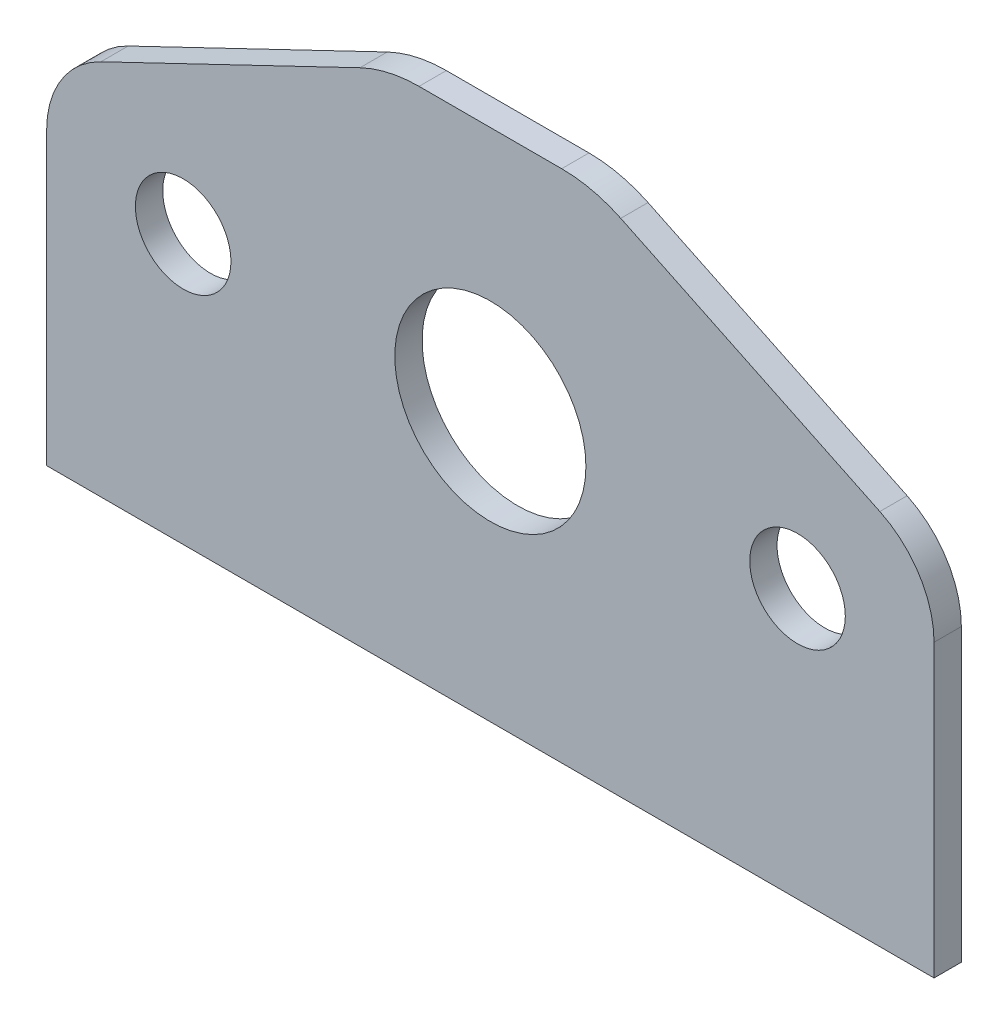
ISO-10303-21;
HEADER;
FILE_DESCRIPTION(('STEP AP214'),'2;1');
FILE_NAME('part.step','',(''),(''),'','','');
FILE_SCHEMA(('AUTOMOTIVE_DESIGN { 1 0 10303 214 1 1 1 1 }'));
ENDSEC;
DATA;
#1=APPLICATION_CONTEXT('core data for automotive mechanical design processes');
#2=APPLICATION_PROTOCOL_DEFINITION('international standard','automotive_design',2000,#1);
#3=PRODUCT_CONTEXT('',#1,'mechanical');
#4=PRODUCT('Part','Part','',(#3));
#5=PRODUCT_RELATED_PRODUCT_CATEGORY('part','',(#4));
#6=PRODUCT_DEFINITION_FORMATION('','',#4);
#7=PRODUCT_DEFINITION_CONTEXT('part definition',#1,'design');
#8=PRODUCT_DEFINITION('design','',#6,#7);
#9=PRODUCT_DEFINITION_SHAPE('','',#8);
#10=(LENGTH_UNIT() NAMED_UNIT(*) SI_UNIT(.MILLI.,.METRE.));
#11=(NAMED_UNIT(*) PLANE_ANGLE_UNIT() SI_UNIT($,.RADIAN.));
#12=(NAMED_UNIT(*) SI_UNIT($,.STERADIAN.) SOLID_ANGLE_UNIT());
#13=UNCERTAINTY_MEASURE_WITH_UNIT(LENGTH_MEASURE(1.E-05),#10,'distance_accuracy_value','');
#14=(GEOMETRIC_REPRESENTATION_CONTEXT(3) GLOBAL_UNCERTAINTY_ASSIGNED_CONTEXT((#13)) GLOBAL_UNIT_ASSIGNED_CONTEXT((#10,
#11,#12)) REPRESENTATION_CONTEXT('',''));
#15=CARTESIAN_POINT('',(0.,0.,0.));
#16=DIRECTION('',(0.,0.,1.));
#17=DIRECTION('',(1.,0.,0.));
#18=AXIS2_PLACEMENT_3D('',#15,#16,#17);
#19=CARTESIAN_POINT('',(-25.5,8.59536221063725,2.));
#20=DIRECTION('',(0.,0.,1.));
#21=DIRECTION('',(1.,0.,0.));
#22=AXIS2_PLACEMENT_3D('',#19,#20,#21);
#23=PLANE('',#22);
#24=CARTESIAN_POINT('',(-22.5,7.,2.));
#25=DIRECTION('',(0.,0.,1.));
#26=DIRECTION('',(1.,0.,0.));
#27=AXIS2_PLACEMENT_3D('',#24,#25,#26);
#28=CIRCLE('',#27,3.5);
#29=CARTESIAN_POINT('',(-19.,7.,2.));
#30=VERTEX_POINT('',#29);
#31=EDGE_CURVE('E211',#30,#30,#28,.T.);
#32=ORIENTED_EDGE('',*,*,#31,.F.);
#33=EDGE_LOOP('',(#32));
#34=FACE_BOUND('',#33,.T.);
#35=DIRECTION('',(0.,-1.,0.));
#36=VECTOR('',#35,1.);
#37=CARTESIAN_POINT('',(-32.5,-12.7,2.));
#38=LINE('',#37,#36);
#39=CARTESIAN_POINT('',(-32.5,8.59536221063722,2.));
#40=VERTEX_POINT('',#39);
#41=CARTESIAN_POINT('',(-32.5,-12.7,2.));
#42=VERTEX_POINT('',#41);
#43=EDGE_CURVE('E160',#40,#42,#38,.T.);
#44=ORIENTED_EDGE('',*,*,#43,.T.);
#45=DIRECTION('',(1.,0.,0.));
#46=VECTOR('',#45,1.);
#47=CARTESIAN_POINT('',(-32.5,-12.7,2.));
#48=LINE('',#47,#46);
#49=CARTESIAN_POINT('',(32.5,-12.7,2.));
#50=VERTEX_POINT('',#49);
#51=EDGE_CURVE('E98',#42,#50,#48,.T.);
#52=ORIENTED_EDGE('',*,*,#51,.T.);
#53=DIRECTION('',(0.,1.,0.));
#54=VECTOR('',#53,1.);
#55=CARTESIAN_POINT('',(32.5,-12.7,2.));
#56=LINE('',#55,#54);
#57=CARTESIAN_POINT('',(32.5,8.59536221063722,2.));
#58=VERTEX_POINT('',#57);
#59=EDGE_CURVE('E181',#50,#58,#56,.T.);
#60=ORIENTED_EDGE('',*,*,#59,.T.);
#61=CARTESIAN_POINT('',(25.5,8.59536221063726,2.));
#62=DIRECTION('',(0.,0.,1.));
#63=DIRECTION('',(-1.,0.,0.));
#64=AXIS2_PLACEMENT_3D('',#61,#62,#63);
#65=CIRCLE('',#64,7.);
#66=CARTESIAN_POINT('',(28.5291174730934,14.9060236129152,2.));
#67=VERTEX_POINT('',#66);
#68=EDGE_CURVE('E200',#58,#67,#65,.T.);
#69=ORIENTED_EDGE('',*,*,#68,.T.);
#70=DIRECTION('',(-0.901523057468274,0.432731067584771,0.));
#71=VECTOR('',#70,1.);
#72=CARTESIAN_POINT('',(28.5291174730934,14.9060236129152,2.));
#73=LINE('',#72,#71);
#74=CARTESIAN_POINT('',(9.551602969411,24.0152305746827,2.));
#75=VERTEX_POINT('',#74);
#76=EDGE_CURVE('E197',#67,#75,#73,.T.);
#77=ORIENTED_EDGE('',*,*,#76,.T.);
#78=CARTESIAN_POINT('',(5.22429229356325,15.,2.));
#79=DIRECTION('',(0.,0.,1.));
#80=DIRECTION('',(1.,0.,0.));
#81=AXIS2_PLACEMENT_3D('',#78,#79,#80);
#82=CIRCLE('',#81,10.);
#83=CARTESIAN_POINT('',(5.22429229356322,25.,2.));
#84=VERTEX_POINT('',#83);
#85=EDGE_CURVE('E199',#75,#84,#82,.T.);
#86=ORIENTED_EDGE('',*,*,#85,.T.);
#87=DIRECTION('',(-1.,0.,0.));
#88=VECTOR('',#87,1.);
#89=CARTESIAN_POINT('',(-5.22429229356322,25.,2.));
#90=LINE('',#89,#88);
#91=CARTESIAN_POINT('',(-5.22429229356322,25.,2.));
#92=VERTEX_POINT('',#91);
#93=EDGE_CURVE('E123',#84,#92,#90,.T.);
#94=ORIENTED_EDGE('',*,*,#93,.T.);
#95=CARTESIAN_POINT('',(-5.22429229356326,15.,2.));
#96=DIRECTION('',(0.,0.,1.));
#97=DIRECTION('',(-1.,0.,0.));
#98=AXIS2_PLACEMENT_3D('',#95,#96,#97);
#99=CIRCLE('',#98,10.);
#100=CARTESIAN_POINT('',(-9.551602969411,24.0152305746827,2.));
#101=VERTEX_POINT('',#100);
#102=EDGE_CURVE('E117',#92,#101,#99,.T.);
#103=ORIENTED_EDGE('',*,*,#102,.T.);
#104=DIRECTION('',(-0.901523057468274,-0.432731067584771,0.));
#105=VECTOR('',#104,1.);
#106=CARTESIAN_POINT('',(-28.5291174730934,14.9060236129152,2.));
#107=LINE('',#106,#105);
#108=CARTESIAN_POINT('',(-28.5291174730934,14.9060236129152,2.));
#109=VERTEX_POINT('',#108);
#110=EDGE_CURVE('E121',#101,#109,#107,.T.);
#111=ORIENTED_EDGE('',*,*,#110,.T.);
#112=CARTESIAN_POINT('',(-25.5,8.59536221063725,2.));
#113=DIRECTION('',(0.,0.,1.));
#114=DIRECTION('',(1.,0.,0.));
#115=AXIS2_PLACEMENT_3D('',#112,#113,#114);
#116=CIRCLE('',#115,7.);
#117=EDGE_CURVE('E49',#109,#40,#116,.T.);
#118=ORIENTED_EDGE('',*,*,#117,.T.);
#119=EDGE_LOOP('',(#44,#52,#60,#69,#77,#86,#94,#103,#111,#118));
#120=FACE_BOUND('',#119,.T.);
#121=CARTESIAN_POINT('',(0.,7.,2.));
#122=DIRECTION('',(0.,0.,1.));
#123=DIRECTION('',(1.,0.,0.));
#124=AXIS2_PLACEMENT_3D('',#121,#122,#123);
#125=CIRCLE('',#124,7.);
#126=CARTESIAN_POINT('',(7.,7.,2.));
#127=VERTEX_POINT('',#126);
#128=EDGE_CURVE('E145',#127,#127,#125,.T.);
#129=ORIENTED_EDGE('',*,*,#128,.F.);
#130=EDGE_LOOP('',(#129));
#131=FACE_BOUND('',#130,.T.);
#132=CARTESIAN_POINT('',(22.5,7.00000000000001,2.));
#133=DIRECTION('',(0.,0.,1.));
#134=DIRECTION('',(1.,0.,0.));
#135=AXIS2_PLACEMENT_3D('',#132,#133,#134);
#136=CIRCLE('',#135,3.5);
#137=CARTESIAN_POINT('',(26.,7.00000000000001,2.));
#138=VERTEX_POINT('',#137);
#139=EDGE_CURVE('E217',#138,#138,#136,.T.);
#140=ORIENTED_EDGE('',*,*,#139,.F.);
#141=EDGE_LOOP('',(#140));
#142=FACE_BOUND('',#141,.T.);
#143=ADVANCED_FACE('F32',(#34,#120,#131,#142),#23,.T.);
#144=CARTESIAN_POINT('',(-25.5,8.59536221063725,0.));
#145=DIRECTION('',(0.,0.,1.));
#146=DIRECTION('',(1.,0.,0.));
#147=AXIS2_PLACEMENT_3D('',#144,#145,#146);
#148=PLANE('',#147);
#149=DIRECTION('',(0.,-1.,0.));
#150=VECTOR('',#149,1.);
#151=CARTESIAN_POINT('',(-32.5,-12.7,0.));
#152=LINE('',#151,#150);
#153=CARTESIAN_POINT('',(-32.5,8.59536221063722,0.));
#154=VERTEX_POINT('',#153);
#155=CARTESIAN_POINT('',(-32.5,-12.7,0.));
#156=VERTEX_POINT('',#155);
#157=EDGE_CURVE('E141',#154,#156,#152,.T.);
#158=ORIENTED_EDGE('',*,*,#157,.F.);
#159=CARTESIAN_POINT('',(-25.5,8.59536221063725,0.));
#160=DIRECTION('',(0.,0.,1.));
#161=DIRECTION('',(1.,0.,0.));
#162=AXIS2_PLACEMENT_3D('',#159,#160,#161);
#163=CIRCLE('',#162,7.);
#164=CARTESIAN_POINT('',(-28.5291174730934,14.9060236129152,0.));
#165=VERTEX_POINT('',#164);
#166=EDGE_CURVE('E90',#165,#154,#163,.T.);
#167=ORIENTED_EDGE('',*,*,#166,.F.);
#168=DIRECTION('',(-0.901523057468274,-0.432731067584771,0.));
#169=VECTOR('',#168,1.);
#170=CARTESIAN_POINT('',(-28.5291174730934,14.9060236129152,0.));
#171=LINE('',#170,#169);
#172=CARTESIAN_POINT('',(-9.551602969411,24.0152305746827,0.));
#173=VERTEX_POINT('',#172);
#174=EDGE_CURVE('E84',#173,#165,#171,.T.);
#175=ORIENTED_EDGE('',*,*,#174,.F.);
#176=CARTESIAN_POINT('',(-5.22429229356326,15.,0.));
#177=DIRECTION('',(0.,0.,1.));
#178=DIRECTION('',(-1.,0.,0.));
#179=AXIS2_PLACEMENT_3D('',#176,#177,#178);
#180=CIRCLE('',#179,10.);
#181=CARTESIAN_POINT('',(-5.22429229356322,25.,0.));
#182=VERTEX_POINT('',#181);
#183=EDGE_CURVE('E131',#182,#173,#180,.T.);
#184=ORIENTED_EDGE('',*,*,#183,.F.);
#185=DIRECTION('',(-1.,0.,0.));
#186=VECTOR('',#185,1.);
#187=CARTESIAN_POINT('',(-5.22429229356322,25.,0.));
#188=LINE('',#187,#186);
#189=CARTESIAN_POINT('',(5.22429229356322,25.,0.));
#190=VERTEX_POINT('',#189);
#191=EDGE_CURVE('E155',#190,#182,#188,.T.);
#192=ORIENTED_EDGE('',*,*,#191,.F.);
#193=CARTESIAN_POINT('',(5.22429229356325,15.,0.));
#194=DIRECTION('',(0.,0.,1.));
#195=DIRECTION('',(1.,0.,0.));
#196=AXIS2_PLACEMENT_3D('',#193,#194,#195);
#197=CIRCLE('',#196,10.);
#198=CARTESIAN_POINT('',(9.551602969411,24.0152305746827,0.));
#199=VERTEX_POINT('',#198);
#200=EDGE_CURVE('E153',#199,#190,#197,.T.);
#201=ORIENTED_EDGE('',*,*,#200,.F.);
#202=DIRECTION('',(-0.901523057468274,0.432731067584771,0.));
#203=VECTOR('',#202,1.);
#204=CARTESIAN_POINT('',(28.5291174730934,14.9060236129152,0.));
#205=LINE('',#204,#203);
#206=CARTESIAN_POINT('',(28.5291174730934,14.9060236129152,0.));
#207=VERTEX_POINT('',#206);
#208=EDGE_CURVE('E151',#207,#199,#205,.T.);
#209=ORIENTED_EDGE('',*,*,#208,.F.);
#210=CARTESIAN_POINT('',(25.5,8.59536221063726,0.));
#211=DIRECTION('',(0.,0.,1.));
#212=DIRECTION('',(-1.,0.,0.));
#213=AXIS2_PLACEMENT_3D('',#210,#211,#212);
#214=CIRCLE('',#213,7.);
#215=CARTESIAN_POINT('',(32.5,8.59536221063722,0.));
#216=VERTEX_POINT('',#215);
#217=EDGE_CURVE('E149',#216,#207,#214,.T.);
#218=ORIENTED_EDGE('',*,*,#217,.F.);
#219=DIRECTION('',(0.,1.,0.));
#220=VECTOR('',#219,1.);
#221=CARTESIAN_POINT('',(32.5,-12.7,0.));
#222=LINE('',#221,#220);
#223=CARTESIAN_POINT('',(32.5,-12.7,0.));
#224=VERTEX_POINT('',#223);
#225=EDGE_CURVE('E147',#224,#216,#222,.T.);
#226=ORIENTED_EDGE('',*,*,#225,.F.);
#227=DIRECTION('',(1.,0.,0.));
#228=VECTOR('',#227,1.);
#229=CARTESIAN_POINT('',(-32.5,-12.7,0.));
#230=LINE('',#229,#228);
#231=EDGE_CURVE('E144',#156,#224,#230,.T.);
#232=ORIENTED_EDGE('',*,*,#231,.F.);
#233=EDGE_LOOP('',(#158,#167,#175,#184,#192,#201,#209,#218,#226,#232));
#234=FACE_BOUND('',#233,.T.);
#235=CARTESIAN_POINT('',(0.,7.,0.));
#236=DIRECTION('',(0.,0.,1.));
#237=DIRECTION('',(1.,0.,0.));
#238=AXIS2_PLACEMENT_3D('',#235,#236,#237);
#239=CIRCLE('',#238,7.);
#240=CARTESIAN_POINT('',(7.,7.,0.));
#241=VERTEX_POINT('',#240);
#242=EDGE_CURVE('E208',#241,#241,#239,.T.);
#243=ORIENTED_EDGE('',*,*,#242,.T.);
#244=EDGE_LOOP('',(#243));
#245=FACE_BOUND('',#244,.T.);
#246=CARTESIAN_POINT('',(-22.5,7.,0.));
#247=DIRECTION('',(0.,0.,1.));
#248=DIRECTION('',(1.,0.,0.));
#249=AXIS2_PLACEMENT_3D('',#246,#247,#248);
#250=CIRCLE('',#249,3.5);
#251=CARTESIAN_POINT('',(-19.,7.,0.));
#252=VERTEX_POINT('',#251);
#253=EDGE_CURVE('E214',#252,#252,#250,.T.);
#254=ORIENTED_EDGE('',*,*,#253,.T.);
#255=EDGE_LOOP('',(#254));
#256=FACE_BOUND('',#255,.T.);
#257=CARTESIAN_POINT('',(22.5,7.00000000000001,0.));
#258=DIRECTION('',(0.,0.,1.));
#259=DIRECTION('',(1.,0.,0.));
#260=AXIS2_PLACEMENT_3D('',#257,#258,#259);
#261=CIRCLE('',#260,3.5);
#262=CARTESIAN_POINT('',(26.,7.00000000000001,0.));
#263=VERTEX_POINT('',#262);
#264=EDGE_CURVE('E220',#263,#263,#261,.T.);
#265=ORIENTED_EDGE('',*,*,#264,.T.);
#266=EDGE_LOOP('',(#265));
#267=FACE_BOUND('',#266,.T.);
#268=ADVANCED_FACE('F185',(#234,#245,#256,#267),#148,.F.);
#269=CARTESIAN_POINT('',(-32.5,-12.7,2.));
#270=DIRECTION('',(1.,0.,0.));
#271=DIRECTION('',(0.,0.,-1.));
#272=AXIS2_PLACEMENT_3D('',#269,#270,#271);
#273=PLANE('',#272);
#274=ORIENTED_EDGE('',*,*,#157,.T.);
#275=DIRECTION('',(0.,0.,-1.));
#276=VECTOR('',#275,1.);
#277=CARTESIAN_POINT('',(-32.5,-12.7,2.));
#278=LINE('',#277,#276);
#279=EDGE_CURVE('E11',#42,#156,#278,.T.);
#280=ORIENTED_EDGE('',*,*,#279,.F.);
#281=ORIENTED_EDGE('',*,*,#43,.F.);
#282=DIRECTION('',(0.,0.,-1.));
#283=VECTOR('',#282,1.);
#284=CARTESIAN_POINT('',(-32.5,8.59536221063722,2.));
#285=LINE('',#284,#283);
#286=EDGE_CURVE('E137',#40,#154,#285,.T.);
#287=ORIENTED_EDGE('',*,*,#286,.T.);
#288=EDGE_LOOP('',(#274,#280,#281,#287));
#289=FACE_BOUND('',#288,.T.);
#290=ADVANCED_FACE('F34',(#289),#273,.F.);
#291=CARTESIAN_POINT('',(-32.5,-12.7,2.));
#292=DIRECTION('',(0.,1.,0.));
#293=DIRECTION('',(-1.,0.,0.));
#294=AXIS2_PLACEMENT_3D('',#291,#292,#293);
#295=PLANE('',#294);
#296=ORIENTED_EDGE('',*,*,#231,.T.);
#297=DIRECTION('',(0.,0.,-1.));
#298=VECTOR('',#297,1.);
#299=CARTESIAN_POINT('',(32.5,-12.7,2.));
#300=LINE('',#299,#298);
#301=EDGE_CURVE('E41',#50,#224,#300,.T.);
#302=ORIENTED_EDGE('',*,*,#301,.F.);
#303=ORIENTED_EDGE('',*,*,#51,.F.);
#304=ORIENTED_EDGE('',*,*,#279,.T.);
#305=EDGE_LOOP('',(#296,#302,#303,#304));
#306=FACE_BOUND('',#305,.T.);
#307=ADVANCED_FACE('F261',(#306),#295,.F.);
#308=CARTESIAN_POINT('',(32.5,-12.7,2.));
#309=DIRECTION('',(-1.,0.,0.));
#310=DIRECTION('',(0.,0.,1.));
#311=AXIS2_PLACEMENT_3D('',#308,#309,#310);
#312=PLANE('',#311);
#313=ORIENTED_EDGE('',*,*,#225,.T.);
#314=DIRECTION('',(0.,0.,-1.));
#315=VECTOR('',#314,1.);
#316=CARTESIAN_POINT('',(32.5,8.59536221063722,2.));
#317=LINE('',#316,#315);
#318=EDGE_CURVE('E173',#58,#216,#317,.T.);
#319=ORIENTED_EDGE('',*,*,#318,.F.);
#320=ORIENTED_EDGE('',*,*,#59,.F.);
#321=ORIENTED_EDGE('',*,*,#301,.T.);
#322=EDGE_LOOP('',(#313,#319,#320,#321));
#323=FACE_BOUND('',#322,.T.);
#324=ADVANCED_FACE('F179',(#323),#312,.F.);
#325=CARTESIAN_POINT('',(25.5,8.59536221063726,2.));
#326=DIRECTION('',(0.,0.,-1.));
#327=DIRECTION('',(-1.,0.,0.));
#328=AXIS2_PLACEMENT_3D('',#325,#326,#327);
#329=CYLINDRICAL_SURFACE('',#328,7.);
#330=ORIENTED_EDGE('',*,*,#217,.T.);
#331=DIRECTION('',(0.,0.,-1.));
#332=VECTOR('',#331,1.);
#333=CARTESIAN_POINT('',(28.5291174730934,14.9060236129152,2.));
#334=LINE('',#333,#332);
#335=EDGE_CURVE('E170',#67,#207,#334,.T.);
#336=ORIENTED_EDGE('',*,*,#335,.F.);
#337=ORIENTED_EDGE('',*,*,#68,.F.);
#338=ORIENTED_EDGE('',*,*,#318,.T.);
#339=EDGE_LOOP('',(#330,#336,#337,#338));
#340=FACE_BOUND('',#339,.T.);
#341=ADVANCED_FACE('F191',(#340),#329,.T.);
#342=CARTESIAN_POINT('',(28.5291174730934,14.9060236129152,2.));
#343=DIRECTION('',(-0.432731067584771,-0.901523057468274,0.));
#344=DIRECTION('',(0.901523057468274,-0.432731067584771,0.));
#345=AXIS2_PLACEMENT_3D('',#342,#343,#344);
#346=PLANE('',#345);
#347=ORIENTED_EDGE('',*,*,#208,.T.);
#348=DIRECTION('',(0.,0.,-1.));
#349=VECTOR('',#348,1.);
#350=CARTESIAN_POINT('',(9.551602969411,24.0152305746827,2.));
#351=LINE('',#350,#349);
#352=EDGE_CURVE('E167',#75,#199,#351,.T.);
#353=ORIENTED_EDGE('',*,*,#352,.F.);
#354=ORIENTED_EDGE('',*,*,#76,.F.);
#355=ORIENTED_EDGE('',*,*,#335,.T.);
#356=EDGE_LOOP('',(#347,#353,#354,#355));
#357=FACE_BOUND('',#356,.T.);
#358=ADVANCED_FACE('F195',(#357),#346,.F.);
#359=CARTESIAN_POINT('',(5.22429229356325,15.,2.));
#360=DIRECTION('',(0.,0.,-1.));
#361=DIRECTION('',(-1.,0.,0.));
#362=AXIS2_PLACEMENT_3D('',#359,#360,#361);
#363=CYLINDRICAL_SURFACE('',#362,10.);
#364=ORIENTED_EDGE('',*,*,#200,.T.);
#365=DIRECTION('',(0.,0.,-1.));
#366=VECTOR('',#365,1.);
#367=CARTESIAN_POINT('',(5.22429229356322,25.,2.));
#368=LINE('',#367,#366);
#369=EDGE_CURVE('E164',#84,#190,#368,.T.);
#370=ORIENTED_EDGE('',*,*,#369,.F.);
#371=ORIENTED_EDGE('',*,*,#85,.F.);
#372=ORIENTED_EDGE('',*,*,#352,.T.);
#373=EDGE_LOOP('',(#364,#370,#371,#372));
#374=FACE_BOUND('',#373,.T.);
#375=ADVANCED_FACE('F251',(#374),#363,.T.);
#376=CARTESIAN_POINT('',(-5.22429229356322,25.,2.));
#377=DIRECTION('',(0.,-1.,0.));
#378=DIRECTION('',(0.,0.,-1.));
#379=AXIS2_PLACEMENT_3D('',#376,#377,#378);
#380=PLANE('',#379);
#381=ORIENTED_EDGE('',*,*,#191,.T.);
#382=DIRECTION('',(0.,0.,-1.));
#383=VECTOR('',#382,1.);
#384=CARTESIAN_POINT('',(-5.22429229356322,25.,2.));
#385=LINE('',#384,#383);
#386=EDGE_CURVE('E132',#92,#182,#385,.T.);
#387=ORIENTED_EDGE('',*,*,#386,.F.);
#388=ORIENTED_EDGE('',*,*,#93,.F.);
#389=ORIENTED_EDGE('',*,*,#369,.T.);
#390=EDGE_LOOP('',(#381,#387,#388,#389));
#391=FACE_BOUND('',#390,.T.);
#392=ADVANCED_FACE('F248',(#391),#380,.F.);
#393=CARTESIAN_POINT('',(-5.22429229356326,15.,2.));
#394=DIRECTION('',(0.,0.,-1.));
#395=DIRECTION('',(-1.,0.,0.));
#396=AXIS2_PLACEMENT_3D('',#393,#394,#395);
#397=CYLINDRICAL_SURFACE('',#396,10.);
#398=ORIENTED_EDGE('',*,*,#183,.T.);
#399=DIRECTION('',(0.,0.,-1.));
#400=VECTOR('',#399,1.);
#401=CARTESIAN_POINT('',(-9.551602969411,24.0152305746827,2.));
#402=LINE('',#401,#400);
#403=EDGE_CURVE('E128',#101,#173,#402,.T.);
#404=ORIENTED_EDGE('',*,*,#403,.F.);
#405=ORIENTED_EDGE('',*,*,#102,.F.);
#406=ORIENTED_EDGE('',*,*,#386,.T.);
#407=EDGE_LOOP('',(#398,#404,#405,#406));
#408=FACE_BOUND('',#407,.T.);
#409=ADVANCED_FACE('F129',(#408),#397,.T.);
#410=CARTESIAN_POINT('',(-28.5291174730934,14.9060236129152,2.));
#411=DIRECTION('',(0.432731067584771,-0.901523057468274,0.));
#412=DIRECTION('',(0.901523057468274,0.432731067584771,0.));
#413=AXIS2_PLACEMENT_3D('',#410,#411,#412);
#414=PLANE('',#413);
#415=ORIENTED_EDGE('',*,*,#174,.T.);
#416=DIRECTION('',(0.,0.,-1.));
#417=VECTOR('',#416,1.);
#418=CARTESIAN_POINT('',(-28.5291174730934,14.9060236129152,2.));
#419=LINE('',#418,#417);
#420=EDGE_CURVE('E133',#109,#165,#419,.T.);
#421=ORIENTED_EDGE('',*,*,#420,.F.);
#422=ORIENTED_EDGE('',*,*,#110,.F.);
#423=ORIENTED_EDGE('',*,*,#403,.T.);
#424=EDGE_LOOP('',(#415,#421,#422,#423));
#425=FACE_BOUND('',#424,.T.);
#426=ADVANCED_FACE('F135',(#425),#414,.F.);
#427=CARTESIAN_POINT('',(-25.5,8.59536221063725,2.));
#428=DIRECTION('',(0.,0.,-1.));
#429=DIRECTION('',(-1.,0.,0.));
#430=AXIS2_PLACEMENT_3D('',#427,#428,#429);
#431=CYLINDRICAL_SURFACE('',#430,7.);
#432=ORIENTED_EDGE('',*,*,#166,.T.);
#433=ORIENTED_EDGE('',*,*,#286,.F.);
#434=ORIENTED_EDGE('',*,*,#117,.F.);
#435=ORIENTED_EDGE('',*,*,#420,.T.);
#436=EDGE_LOOP('',(#432,#433,#434,#435));
#437=FACE_BOUND('',#436,.T.);
#438=ADVANCED_FACE('F241',(#437),#431,.T.);
#439=CARTESIAN_POINT('',(0.,7.,2.));
#440=DIRECTION('',(0.,0.,-1.));
#441=DIRECTION('',(-1.,0.,0.));
#442=AXIS2_PLACEMENT_3D('',#439,#440,#441);
#443=CYLINDRICAL_SURFACE('',#442,7.);
#444=ORIENTED_EDGE('',*,*,#128,.T.);
#445=EDGE_LOOP('',(#444));
#446=FACE_BOUND('',#445,.T.);
#447=ORIENTED_EDGE('',*,*,#242,.F.);
#448=EDGE_LOOP('',(#447));
#449=FACE_BOUND('',#448,.T.);
#450=ADVANCED_FACE('F238',(#446,#449),#443,.F.);
#451=CARTESIAN_POINT('',(-22.5,7.,2.));
#452=DIRECTION('',(0.,0.,-1.));
#453=DIRECTION('',(-1.,0.,0.));
#454=AXIS2_PLACEMENT_3D('',#451,#452,#453);
#455=CYLINDRICAL_SURFACE('',#454,3.5);
#456=ORIENTED_EDGE('',*,*,#31,.T.);
#457=EDGE_LOOP('',(#456));
#458=FACE_BOUND('',#457,.T.);
#459=ORIENTED_EDGE('',*,*,#253,.F.);
#460=EDGE_LOOP('',(#459));
#461=FACE_BOUND('',#460,.T.);
#462=ADVANCED_FACE('F337',(#458,#461),#455,.F.);
#463=CARTESIAN_POINT('',(22.5,7.00000000000001,2.));
#464=DIRECTION('',(0.,0.,-1.));
#465=DIRECTION('',(-1.,0.,0.));
#466=AXIS2_PLACEMENT_3D('',#463,#464,#465);
#467=CYLINDRICAL_SURFACE('',#466,3.5);
#468=ORIENTED_EDGE('',*,*,#139,.T.);
#469=EDGE_LOOP('',(#468));
#470=FACE_BOUND('',#469,.T.);
#471=ORIENTED_EDGE('',*,*,#264,.F.);
#472=EDGE_LOOP('',(#471));
#473=FACE_BOUND('',#472,.T.);
#474=ADVANCED_FACE('F226',(#470,#473),#467,.F.);
#475=CLOSED_SHELL('',(#143,#268,#290,#307,#324,#341,#358,#375,#392,#409,#426,#438,#450,#462,#474));
#476=MANIFOLD_SOLID_BREP('B2',#475);
#477=ADVANCED_BREP_SHAPE_REPRESENTATION('',(#18,#476),#14);
#478=SHAPE_DEFINITION_REPRESENTATION(#9,#477);
ENDSEC;
END-ISO-10303-21;
